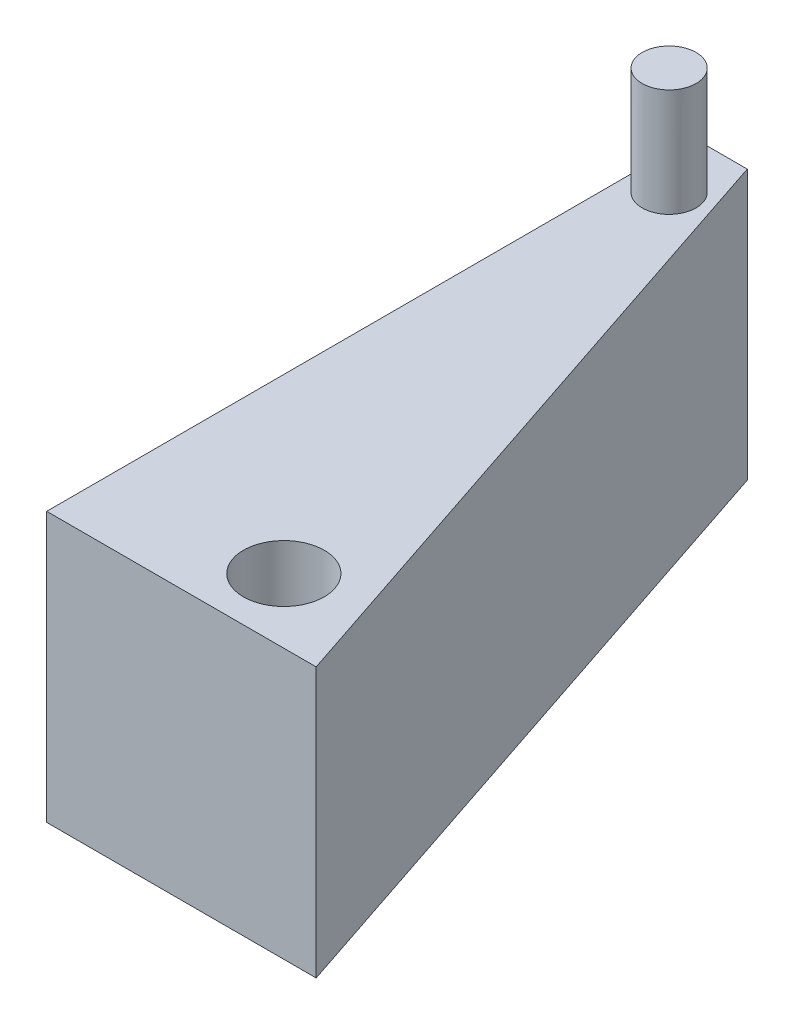
ISO-10303-21;
HEADER;
FILE_DESCRIPTION(('STEP AP214'),'2;1');
FILE_NAME('part.step','',(''),(''),'','','');
FILE_SCHEMA(('AUTOMOTIVE_DESIGN { 1 0 10303 214 1 1 1 1 }'));
ENDSEC;
DATA;
#1=APPLICATION_CONTEXT('core data for automotive mechanical design processes');
#2=APPLICATION_PROTOCOL_DEFINITION('international standard','automotive_design',2000,#1);
#3=PRODUCT_CONTEXT('',#1,'mechanical');
#4=PRODUCT('Part','Part','',(#3));
#5=PRODUCT_RELATED_PRODUCT_CATEGORY('part','',(#4));
#6=PRODUCT_DEFINITION_FORMATION('','',#4);
#7=PRODUCT_DEFINITION_CONTEXT('part definition',#1,'design');
#8=PRODUCT_DEFINITION('design','',#6,#7);
#9=PRODUCT_DEFINITION_SHAPE('','',#8);
#10=(LENGTH_UNIT() NAMED_UNIT(*) SI_UNIT(.MILLI.,.METRE.));
#11=(NAMED_UNIT(*) PLANE_ANGLE_UNIT() SI_UNIT($,.RADIAN.));
#12=(NAMED_UNIT(*) SI_UNIT($,.STERADIAN.) SOLID_ANGLE_UNIT());
#13=UNCERTAINTY_MEASURE_WITH_UNIT(LENGTH_MEASURE(1.E-05),#10,'distance_accuracy_value','');
#14=(GEOMETRIC_REPRESENTATION_CONTEXT(3) GLOBAL_UNCERTAINTY_ASSIGNED_CONTEXT((#13)) GLOBAL_UNIT_ASSIGNED_CONTEXT((#10,
#11,#12)) REPRESENTATION_CONTEXT('',''));
#15=CARTESIAN_POINT('',(0.,0.,0.));
#16=DIRECTION('',(0.,0.,1.));
#17=DIRECTION('',(1.,0.,0.));
#18=AXIS2_PLACEMENT_3D('',#15,#16,#17);
#19=CARTESIAN_POINT('',(31.75,31.75,0.));
#20=DIRECTION('',(0.,0.,-1.));
#21=DIRECTION('',(-1.,0.,0.));
#22=AXIS2_PLACEMENT_3D('',#19,#20,#21);
#23=PLANE('',#22);
#24=DIRECTION('',(1.,0.,0.));
#25=VECTOR('',#24,1.);
#26=CARTESIAN_POINT('',(31.75,0.,0.));
#27=LINE('',#26,#25);
#28=CARTESIAN_POINT('',(0.,0.,0.));
#29=VERTEX_POINT('',#28);
#30=CARTESIAN_POINT('',(31.75,0.,0.));
#31=VERTEX_POINT('',#30);
#32=EDGE_CURVE('E99',#29,#31,#27,.T.);
#33=ORIENTED_EDGE('',*,*,#32,.T.);
#34=DIRECTION('',(0.,-1.,0.));
#35=VECTOR('',#34,1.);
#36=CARTESIAN_POINT('',(31.75,31.75,0.));
#37=LINE('',#36,#35);
#38=CARTESIAN_POINT('',(31.75,31.75,0.));
#39=VERTEX_POINT('',#38);
#40=EDGE_CURVE('E41',#39,#31,#37,.T.);
#41=ORIENTED_EDGE('',*,*,#40,.F.);
#42=DIRECTION('',(1.,0.,0.));
#43=VECTOR('',#42,1.);
#44=CARTESIAN_POINT('',(31.75,31.75,0.));
#45=LINE('',#44,#43);
#46=CARTESIAN_POINT('',(0.,31.75,0.));
#47=VERTEX_POINT('',#46);
#48=EDGE_CURVE('E85',#47,#39,#45,.T.);
#49=ORIENTED_EDGE('',*,*,#48,.F.);
#50=DIRECTION('',(0.,-1.,0.));
#51=VECTOR('',#50,1.);
#52=CARTESIAN_POINT('',(0.,31.75,0.));
#53=LINE('',#52,#51);
#54=EDGE_CURVE('E95',#47,#29,#53,.T.);
#55=ORIENTED_EDGE('',*,*,#54,.T.);
#56=EDGE_LOOP('',(#33,#41,#49,#55));
#57=FACE_BOUND('',#56,.T.);
#58=ADVANCED_FACE('F33',(#57),#23,.F.);
#59=CARTESIAN_POINT('',(6.35,31.75,-76.2));
#60=DIRECTION('',(-0.948683298050514,0.,0.316227766016838));
#61=DIRECTION('',(0.316227766016838,0.,0.948683298050514));
#62=AXIS2_PLACEMENT_3D('',#59,#60,#61);
#63=PLANE('',#62);
#64=DIRECTION('',(-0.316227766016838,0.,-0.948683298050514));
#65=VECTOR('',#64,1.);
#66=CARTESIAN_POINT('',(6.35,0.,-76.2));
#67=LINE('',#66,#65);
#68=CARTESIAN_POINT('',(6.35,0.,-76.2));
#69=VERTEX_POINT('',#68);
#70=EDGE_CURVE('E90',#31,#69,#67,.T.);
#71=ORIENTED_EDGE('',*,*,#70,.T.);
#72=DIRECTION('',(0.,-1.,0.));
#73=VECTOR('',#72,1.);
#74=CARTESIAN_POINT('',(6.35,31.75,-76.2));
#75=LINE('',#74,#73);
#76=CARTESIAN_POINT('',(6.35,31.75,-76.2));
#77=VERTEX_POINT('',#76);
#78=EDGE_CURVE('E88',#77,#69,#75,.T.);
#79=ORIENTED_EDGE('',*,*,#78,.F.);
#80=DIRECTION('',(-0.316227766016838,0.,-0.948683298050514));
#81=VECTOR('',#80,1.);
#82=CARTESIAN_POINT('',(6.35,31.75,-76.2));
#83=LINE('',#82,#81);
#84=EDGE_CURVE('E80',#39,#77,#83,.T.);
#85=ORIENTED_EDGE('',*,*,#84,.F.);
#86=ORIENTED_EDGE('',*,*,#40,.T.);
#87=EDGE_LOOP('',(#71,#79,#85,#86));
#88=FACE_BOUND('',#87,.T.);
#89=ADVANCED_FACE('F89',(#88),#63,.F.);
#90=CARTESIAN_POINT('',(0.,31.75,-76.2));
#91=DIRECTION('',(0.,0.,1.));
#92=DIRECTION('',(1.,0.,0.));
#93=AXIS2_PLACEMENT_3D('',#90,#91,#92);
#94=PLANE('',#93);
#95=DIRECTION('',(-1.,0.,0.));
#96=VECTOR('',#95,1.);
#97=CARTESIAN_POINT('',(0.,0.,-76.2));
#98=LINE('',#97,#96);
#99=CARTESIAN_POINT('',(0.,0.,-76.2));
#100=VERTEX_POINT('',#99);
#101=EDGE_CURVE('E66',#69,#100,#98,.T.);
#102=ORIENTED_EDGE('',*,*,#101,.T.);
#103=DIRECTION('',(0.,-1.,0.));
#104=VECTOR('',#103,1.);
#105=CARTESIAN_POINT('',(0.,31.75,-76.2));
#106=LINE('',#105,#104);
#107=CARTESIAN_POINT('',(0.,31.75,-76.2));
#108=VERTEX_POINT('',#107);
#109=EDGE_CURVE('E91',#108,#100,#106,.T.);
#110=ORIENTED_EDGE('',*,*,#109,.F.);
#111=DIRECTION('',(-1.,0.,0.));
#112=VECTOR('',#111,1.);
#113=CARTESIAN_POINT('',(0.,31.75,-76.2));
#114=LINE('',#113,#112);
#115=EDGE_CURVE('E83',#77,#108,#114,.T.);
#116=ORIENTED_EDGE('',*,*,#115,.F.);
#117=ORIENTED_EDGE('',*,*,#78,.T.);
#118=EDGE_LOOP('',(#102,#110,#116,#117));
#119=FACE_BOUND('',#118,.T.);
#120=ADVANCED_FACE('F93',(#119),#94,.F.);
#121=CARTESIAN_POINT('',(0.,31.75,0.));
#122=DIRECTION('',(1.,0.,0.));
#123=DIRECTION('',(0.,0.,-1.));
#124=AXIS2_PLACEMENT_3D('',#121,#122,#123);
#125=PLANE('',#124);
#126=DIRECTION('',(0.,0.,1.));
#127=VECTOR('',#126,1.);
#128=CARTESIAN_POINT('',(0.,0.,0.));
#129=LINE('',#128,#127);
#130=EDGE_CURVE('E72',#100,#29,#129,.T.);
#131=ORIENTED_EDGE('',*,*,#130,.T.);
#132=ORIENTED_EDGE('',*,*,#54,.F.);
#133=DIRECTION('',(0.,0.,1.));
#134=VECTOR('',#133,1.);
#135=CARTESIAN_POINT('',(0.,31.75,0.));
#136=LINE('',#135,#134);
#137=EDGE_CURVE('E49',#108,#47,#136,.T.);
#138=ORIENTED_EDGE('',*,*,#137,.F.);
#139=ORIENTED_EDGE('',*,*,#109,.T.);
#140=EDGE_LOOP('',(#131,#132,#138,#139));
#141=FACE_BOUND('',#140,.T.);
#142=ADVANCED_FACE('F123',(#141),#125,.F.);
#143=CARTESIAN_POINT('',(0.,31.75,0.));
#144=DIRECTION('',(0.,-1.,0.));
#145=DIRECTION('',(0.,0.,-1.));
#146=AXIS2_PLACEMENT_3D('',#143,#144,#145);
#147=PLANE('',#146);
#148=CARTESIAN_POINT('',(4.1275,31.75,-69.215));
#149=DIRECTION('',(0.,-1.,0.));
#150=DIRECTION('',(0.,0.,-1.));
#151=AXIS2_PLACEMENT_3D('',#148,#149,#150);
#152=CIRCLE('',#151,3.175);
#153=CARTESIAN_POINT('',(4.1275,31.75,-72.39));
#154=VERTEX_POINT('',#153);
#155=EDGE_CURVE('E11',#154,#154,#152,.F.);
#156=ORIENTED_EDGE('',*,*,#155,.F.);
#157=EDGE_LOOP('',(#156));
#158=FACE_BOUND('',#157,.T.);
#159=CARTESIAN_POINT('',(20.32,31.75,-7.62));
#160=DIRECTION('',(0.,1.,0.));
#161=DIRECTION('',(0.,0.,1.));
#162=AXIS2_PLACEMENT_3D('',#159,#160,#161);
#163=CIRCLE('',#162,4.7625);
#164=CARTESIAN_POINT('',(20.32,31.75,-2.8575));
#165=VERTEX_POINT('',#164);
#166=EDGE_CURVE('E174',#165,#165,#163,.T.);
#167=ORIENTED_EDGE('',*,*,#166,.F.);
#168=EDGE_LOOP('',(#167));
#169=FACE_BOUND('',#168,.T.);
#170=ORIENTED_EDGE('',*,*,#48,.T.);
#171=ORIENTED_EDGE('',*,*,#84,.T.);
#172=ORIENTED_EDGE('',*,*,#115,.T.);
#173=ORIENTED_EDGE('',*,*,#137,.T.);
#174=EDGE_LOOP('',(#170,#171,#172,#173));
#175=FACE_BOUND('',#174,.T.);
#176=ADVANCED_FACE('F81',(#158,#169,#175),#147,.F.);
#177=CARTESIAN_POINT('',(0.,0.,0.));
#178=DIRECTION('',(0.,-1.,0.));
#179=DIRECTION('',(0.,0.,-1.));
#180=AXIS2_PLACEMENT_3D('',#177,#178,#179);
#181=PLANE('',#180);
#182=CARTESIAN_POINT('',(20.32,0.,-7.62));
#183=DIRECTION('',(0.,1.,0.));
#184=DIRECTION('',(0.,0.,1.));
#185=AXIS2_PLACEMENT_3D('',#182,#183,#184);
#186=CIRCLE('',#185,4.7625);
#187=CARTESIAN_POINT('',(20.32,0.,-2.8575));
#188=VERTEX_POINT('',#187);
#189=EDGE_CURVE('E102',#188,#188,#186,.T.);
#190=ORIENTED_EDGE('',*,*,#189,.T.);
#191=EDGE_LOOP('',(#190));
#192=FACE_BOUND('',#191,.T.);
#193=ORIENTED_EDGE('',*,*,#32,.F.);
#194=ORIENTED_EDGE('',*,*,#130,.F.);
#195=ORIENTED_EDGE('',*,*,#101,.F.);
#196=ORIENTED_EDGE('',*,*,#70,.F.);
#197=EDGE_LOOP('',(#193,#194,#195,#196));
#198=FACE_BOUND('',#197,.T.);
#199=ADVANCED_FACE('F110',(#192,#198),#181,.T.);
#200=CARTESIAN_POINT('',(20.32,0.,-7.62));
#201=DIRECTION('',(0.,1.,0.));
#202=DIRECTION('',(0.,0.,1.));
#203=AXIS2_PLACEMENT_3D('',#200,#201,#202);
#204=CYLINDRICAL_SURFACE('',#203,4.7625);
#205=ORIENTED_EDGE('',*,*,#189,.F.);
#206=EDGE_LOOP('',(#205));
#207=FACE_BOUND('',#206,.T.);
#208=ORIENTED_EDGE('',*,*,#166,.T.);
#209=EDGE_LOOP('',(#208));
#210=FACE_BOUND('',#209,.T.);
#211=ADVANCED_FACE('F112',(#207,#210),#204,.F.);
#212=CARTESIAN_POINT('',(4.1275,44.45,-69.215));
#213=DIRECTION('',(0.,-1.,0.));
#214=DIRECTION('',(0.,0.,-1.));
#215=AXIS2_PLACEMENT_3D('',#212,#213,#214);
#216=CYLINDRICAL_SURFACE('',#215,3.175);
#217=CARTESIAN_POINT('',(4.1275,44.45,-69.215));
#218=DIRECTION('',(0.,1.,0.));
#219=DIRECTION('',(0.,0.,1.));
#220=AXIS2_PLACEMENT_3D('',#217,#218,#219);
#221=CIRCLE('',#220,3.175);
#222=CARTESIAN_POINT('',(4.1275,44.45,-66.04));
#223=VERTEX_POINT('',#222);
#224=EDGE_CURVE('E173',#223,#223,#221,.T.);
#225=ORIENTED_EDGE('',*,*,#224,.F.);
#226=EDGE_LOOP('',(#225));
#227=FACE_BOUND('',#226,.T.);
#228=ORIENTED_EDGE('',*,*,#155,.T.);
#229=EDGE_LOOP('',(#228));
#230=FACE_BOUND('',#229,.T.);
#231=ADVANCED_FACE('F119',(#227,#230),#216,.T.);
#232=CARTESIAN_POINT('',(4.1275,44.45,-69.215));
#233=DIRECTION('',(0.,1.,0.));
#234=DIRECTION('',(0.,0.,1.));
#235=AXIS2_PLACEMENT_3D('',#232,#233,#234);
#236=PLANE('',#235);
#237=ORIENTED_EDGE('',*,*,#224,.T.);
#238=EDGE_LOOP('',(#237));
#239=FACE_BOUND('',#238,.T.);
#240=ADVANCED_FACE('F157',(#239),#236,.T.);
#241=CLOSED_SHELL('',(#58,#89,#120,#142,#176,#199,#211,#231,#240));
#242=MANIFOLD_SOLID_BREP('B2',#241);
#243=ADVANCED_BREP_SHAPE_REPRESENTATION('',(#18,#242),#14);
#244=SHAPE_DEFINITION_REPRESENTATION(#9,#243);
ENDSEC;
END-ISO-10303-21;
